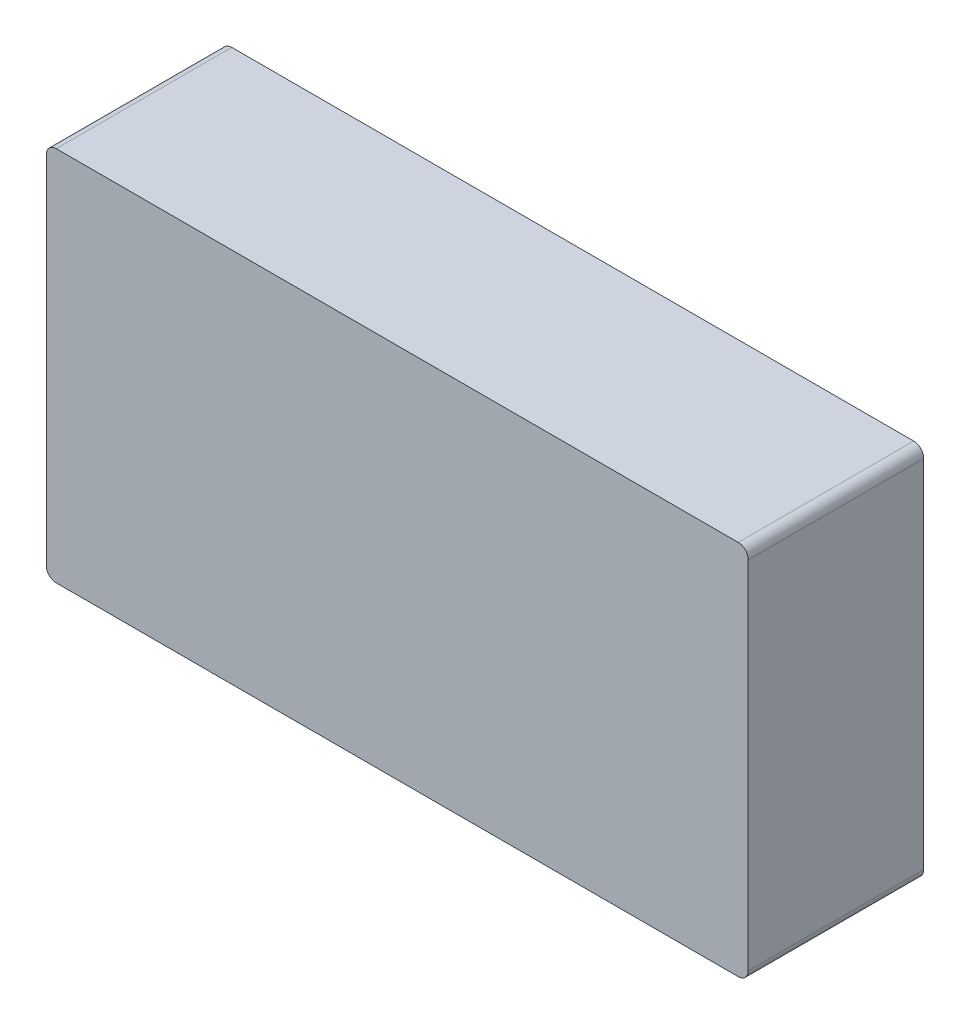
ISO-10303-21;
HEADER;
FILE_DESCRIPTION(('STEP AP214'),'2;1');
FILE_NAME('part.step','',(''),(''),'','','');
FILE_SCHEMA(('AUTOMOTIVE_DESIGN { 1 0 10303 214 1 1 1 1 }'));
ENDSEC;
DATA;
#1=APPLICATION_CONTEXT('core data for automotive mechanical design processes');
#2=APPLICATION_PROTOCOL_DEFINITION('international standard','automotive_design',2000,#1);
#3=PRODUCT_CONTEXT('',#1,'mechanical');
#4=PRODUCT('Part','Part','',(#3));
#5=PRODUCT_RELATED_PRODUCT_CATEGORY('part','',(#4));
#6=PRODUCT_DEFINITION_FORMATION('','',#4);
#7=PRODUCT_DEFINITION_CONTEXT('part definition',#1,'design');
#8=PRODUCT_DEFINITION('design','',#6,#7);
#9=PRODUCT_DEFINITION_SHAPE('','',#8);
#10=(LENGTH_UNIT() NAMED_UNIT(*) SI_UNIT(.MILLI.,.METRE.));
#11=(NAMED_UNIT(*) PLANE_ANGLE_UNIT() SI_UNIT($,.RADIAN.));
#12=(NAMED_UNIT(*) SI_UNIT($,.STERADIAN.) SOLID_ANGLE_UNIT());
#13=UNCERTAINTY_MEASURE_WITH_UNIT(LENGTH_MEASURE(1.E-05),#10,'distance_accuracy_value','');
#14=(GEOMETRIC_REPRESENTATION_CONTEXT(3) GLOBAL_UNCERTAINTY_ASSIGNED_CONTEXT((#13)) GLOBAL_UNIT_ASSIGNED_CONTEXT((#10,
#11,#12)) REPRESENTATION_CONTEXT('',''));
#15=CARTESIAN_POINT('',(0.,0.,0.));
#16=DIRECTION('',(0.,0.,1.));
#17=DIRECTION('',(1.,0.,0.));
#18=AXIS2_PLACEMENT_3D('',#15,#16,#17);
#19=CARTESIAN_POINT('',(0.,0.,0.));
#20=DIRECTION('',(0.,0.,-1.));
#21=DIRECTION('',(-1.,0.,0.));
#22=AXIS2_PLACEMENT_3D('',#19,#20,#21);
#23=PLANE('',#22);
#24=DIRECTION('',(0.,1.,0.));
#25=VECTOR('',#24,1.);
#26=CARTESIAN_POINT('',(70.,-37.5,0.));
#27=LINE('',#26,#25);
#28=CARTESIAN_POINT('',(70.,-35.5,0.));
#29=VERTEX_POINT('',#28);
#30=CARTESIAN_POINT('',(70.,35.5,0.));
#31=VERTEX_POINT('',#30);
#32=EDGE_CURVE('E153',#29,#31,#27,.T.);
#33=ORIENTED_EDGE('',*,*,#32,.F.);
#34=CARTESIAN_POINT('',(68.,-35.5,0.));
#35=DIRECTION('',(0.,0.,-1.));
#36=DIRECTION('',(-1.,0.,0.));
#37=AXIS2_PLACEMENT_3D('',#34,#35,#36);
#38=CIRCLE('',#37,2.);
#39=CARTESIAN_POINT('',(68.,-37.5,0.));
#40=VERTEX_POINT('',#39);
#41=EDGE_CURVE('E201',#29,#40,#38,.T.);
#42=ORIENTED_EDGE('',*,*,#41,.T.);
#43=DIRECTION('',(1.,0.,0.));
#44=VECTOR('',#43,1.);
#45=CARTESIAN_POINT('',(-70.,-37.5,0.));
#46=LINE('',#45,#44);
#47=CARTESIAN_POINT('',(-68.,-37.5,0.));
#48=VERTEX_POINT('',#47);
#49=EDGE_CURVE('E179',#48,#40,#46,.T.);
#50=ORIENTED_EDGE('',*,*,#49,.F.);
#51=CARTESIAN_POINT('',(-68.,-35.5,0.));
#52=DIRECTION('',(0.,0.,-1.));
#53=DIRECTION('',(-1.,0.,0.));
#54=AXIS2_PLACEMENT_3D('',#51,#52,#53);
#55=CIRCLE('',#54,2.);
#56=CARTESIAN_POINT('',(-70.,-35.5,0.));
#57=VERTEX_POINT('',#56);
#58=EDGE_CURVE('E203',#48,#57,#55,.T.);
#59=ORIENTED_EDGE('',*,*,#58,.T.);
#60=DIRECTION('',(0.,-1.,0.));
#61=VECTOR('',#60,1.);
#62=CARTESIAN_POINT('',(-70.,-37.5,0.));
#63=LINE('',#62,#61);
#64=CARTESIAN_POINT('',(-70.,35.5,0.));
#65=VERTEX_POINT('',#64);
#66=EDGE_CURVE('E190',#65,#57,#63,.T.);
#67=ORIENTED_EDGE('',*,*,#66,.F.);
#68=CARTESIAN_POINT('',(-68.,35.5,0.));
#69=DIRECTION('',(0.,0.,-1.));
#70=DIRECTION('',(-1.,0.,0.));
#71=AXIS2_PLACEMENT_3D('',#68,#69,#70);
#72=CIRCLE('',#71,2.);
#73=CARTESIAN_POINT('',(-68.,37.5,0.));
#74=VERTEX_POINT('',#73);
#75=EDGE_CURVE('E200',#65,#74,#72,.T.);
#76=ORIENTED_EDGE('',*,*,#75,.T.);
#77=DIRECTION('',(-1.,0.,0.));
#78=VECTOR('',#77,1.);
#79=CARTESIAN_POINT('',(-70.,37.5,0.));
#80=LINE('',#79,#78);
#81=CARTESIAN_POINT('',(68.,37.5,0.));
#82=VERTEX_POINT('',#81);
#83=EDGE_CURVE('E160',#82,#74,#80,.T.);
#84=ORIENTED_EDGE('',*,*,#83,.F.);
#85=CARTESIAN_POINT('',(68.,35.5,0.));
#86=DIRECTION('',(0.,0.,-1.));
#87=DIRECTION('',(-1.,0.,0.));
#88=AXIS2_PLACEMENT_3D('',#85,#86,#87);
#89=CIRCLE('',#88,2.);
#90=EDGE_CURVE('E197',#82,#31,#89,.T.);
#91=ORIENTED_EDGE('',*,*,#90,.T.);
#92=EDGE_LOOP('',(#33,#42,#50,#59,#67,#76,#84,#91));
#93=FACE_BOUND('',#92,.T.);
#94=DIRECTION('',(1.,0.,0.));
#95=VECTOR('',#94,1.);
#96=CARTESIAN_POINT('',(0.,-35.,0.));
#97=LINE('',#96,#95);
#98=CARTESIAN_POINT('',(-67.5,-35.,0.));
#99=VERTEX_POINT('',#98);
#100=CARTESIAN_POINT('',(67.5,-35.,0.));
#101=VERTEX_POINT('',#100);
#102=EDGE_CURVE('E146',#99,#101,#97,.T.);
#103=ORIENTED_EDGE('',*,*,#102,.T.);
#104=DIRECTION('',(0.,1.,0.));
#105=VECTOR('',#104,1.);
#106=CARTESIAN_POINT('',(67.5,0.,0.));
#107=LINE('',#106,#105);
#108=CARTESIAN_POINT('',(67.5,35.,0.));
#109=VERTEX_POINT('',#108);
#110=EDGE_CURVE('E170',#101,#109,#107,.T.);
#111=ORIENTED_EDGE('',*,*,#110,.T.);
#112=DIRECTION('',(-1.,0.,0.));
#113=VECTOR('',#112,1.);
#114=CARTESIAN_POINT('',(0.,35.,0.));
#115=LINE('',#114,#113);
#116=CARTESIAN_POINT('',(-67.5,35.,0.));
#117=VERTEX_POINT('',#116);
#118=EDGE_CURVE('E155',#109,#117,#115,.T.);
#119=ORIENTED_EDGE('',*,*,#118,.T.);
#120=DIRECTION('',(0.,-1.,0.));
#121=VECTOR('',#120,1.);
#122=CARTESIAN_POINT('',(-67.5,0.,0.));
#123=LINE('',#122,#121);
#124=EDGE_CURVE('E173',#117,#99,#123,.T.);
#125=ORIENTED_EDGE('',*,*,#124,.T.);
#126=EDGE_LOOP('',(#103,#111,#119,#125));
#127=FACE_BOUND('',#126,.T.);
#128=ADVANCED_FACE('F39',(#93,#127),#23,.T.);
#129=CARTESIAN_POINT('',(70.,-37.5,35.));
#130=DIRECTION('',(-1.,0.,0.));
#131=DIRECTION('',(0.,0.,1.));
#132=AXIS2_PLACEMENT_3D('',#129,#130,#131);
#133=PLANE('',#132);
#134=DIRECTION('',(0.,1.,0.));
#135=VECTOR('',#134,1.);
#136=CARTESIAN_POINT('',(70.,-37.5,35.));
#137=LINE('',#136,#135);
#138=CARTESIAN_POINT('',(70.,-35.5,35.));
#139=VERTEX_POINT('',#138);
#140=CARTESIAN_POINT('',(70.,35.5,35.));
#141=VERTEX_POINT('',#140);
#142=EDGE_CURVE('E171',#139,#141,#137,.T.);
#143=ORIENTED_EDGE('',*,*,#142,.F.);
#144=DIRECTION('',(0.,0.,-1.));
#145=VECTOR('',#144,1.);
#146=CARTESIAN_POINT('',(70.,-35.5,35.));
#147=LINE('',#146,#145);
#148=EDGE_CURVE('E194',#139,#29,#147,.T.);
#149=ORIENTED_EDGE('',*,*,#148,.T.);
#150=ORIENTED_EDGE('',*,*,#32,.T.);
#151=DIRECTION('',(0.,0.,-1.));
#152=VECTOR('',#151,1.);
#153=CARTESIAN_POINT('',(70.,35.5,35.));
#154=LINE('',#153,#152);
#155=EDGE_CURVE('E183',#31,#141,#154,.F.);
#156=ORIENTED_EDGE('',*,*,#155,.T.);
#157=EDGE_LOOP('',(#143,#149,#150,#156));
#158=FACE_BOUND('',#157,.T.);
#159=ADVANCED_FACE('F251',(#158),#133,.F.);
#160=CARTESIAN_POINT('',(-70.,37.5,35.));
#161=DIRECTION('',(0.,-1.,0.));
#162=DIRECTION('',(0.,0.,-1.));
#163=AXIS2_PLACEMENT_3D('',#160,#161,#162);
#164=PLANE('',#163);
#165=ORIENTED_EDGE('',*,*,#83,.T.);
#166=DIRECTION('',(0.,0.,-1.));
#167=VECTOR('',#166,1.);
#168=CARTESIAN_POINT('',(-68.,37.5,35.));
#169=LINE('',#168,#167);
#170=CARTESIAN_POINT('',(-68.,37.5,35.));
#171=VERTEX_POINT('',#170);
#172=EDGE_CURVE('E11',#74,#171,#169,.F.);
#173=ORIENTED_EDGE('',*,*,#172,.T.);
#174=DIRECTION('',(-1.,0.,0.));
#175=VECTOR('',#174,1.);
#176=CARTESIAN_POINT('',(-70.,37.5,35.));
#177=LINE('',#176,#175);
#178=CARTESIAN_POINT('',(68.,37.5,35.));
#179=VERTEX_POINT('',#178);
#180=EDGE_CURVE('E178',#179,#171,#177,.T.);
#181=ORIENTED_EDGE('',*,*,#180,.F.);
#182=DIRECTION('',(0.,0.,-1.));
#183=VECTOR('',#182,1.);
#184=CARTESIAN_POINT('',(68.,37.5,35.));
#185=LINE('',#184,#183);
#186=EDGE_CURVE('E50',#179,#82,#185,.T.);
#187=ORIENTED_EDGE('',*,*,#186,.T.);
#188=EDGE_LOOP('',(#165,#173,#181,#187));
#189=FACE_BOUND('',#188,.T.);
#190=ADVANCED_FACE('F223',(#189),#164,.F.);
#191=CARTESIAN_POINT('',(-70.,-37.5,35.));
#192=DIRECTION('',(1.,0.,0.));
#193=DIRECTION('',(0.,0.,-1.));
#194=AXIS2_PLACEMENT_3D('',#191,#192,#193);
#195=PLANE('',#194);
#196=ORIENTED_EDGE('',*,*,#66,.T.);
#197=DIRECTION('',(0.,0.,-1.));
#198=VECTOR('',#197,1.);
#199=CARTESIAN_POINT('',(-70.,-35.5,35.));
#200=LINE('',#199,#198);
#201=CARTESIAN_POINT('',(-70.,-35.5,35.));
#202=VERTEX_POINT('',#201);
#203=EDGE_CURVE('E53',#57,#202,#200,.F.);
#204=ORIENTED_EDGE('',*,*,#203,.T.);
#205=DIRECTION('',(0.,-1.,0.));
#206=VECTOR('',#205,1.);
#207=CARTESIAN_POINT('',(-70.,-37.5,35.));
#208=LINE('',#207,#206);
#209=CARTESIAN_POINT('',(-70.,35.5,35.));
#210=VERTEX_POINT('',#209);
#211=EDGE_CURVE('E182',#210,#202,#208,.T.);
#212=ORIENTED_EDGE('',*,*,#211,.F.);
#213=DIRECTION('',(0.,0.,-1.));
#214=VECTOR('',#213,1.);
#215=CARTESIAN_POINT('',(-70.,35.5,35.));
#216=LINE('',#215,#214);
#217=EDGE_CURVE('E220',#210,#65,#216,.T.);
#218=ORIENTED_EDGE('',*,*,#217,.T.);
#219=EDGE_LOOP('',(#196,#204,#212,#218));
#220=FACE_BOUND('',#219,.T.);
#221=ADVANCED_FACE('F237',(#220),#195,.F.);
#222=CARTESIAN_POINT('',(-70.,-37.5,35.));
#223=DIRECTION('',(0.,1.,0.));
#224=DIRECTION('',(0.,0.,1.));
#225=AXIS2_PLACEMENT_3D('',#222,#223,#224);
#226=PLANE('',#225);
#227=ORIENTED_EDGE('',*,*,#49,.T.);
#228=DIRECTION('',(0.,0.,-1.));
#229=VECTOR('',#228,1.);
#230=CARTESIAN_POINT('',(68.,-37.5,35.));
#231=LINE('',#230,#229);
#232=CARTESIAN_POINT('',(68.,-37.5,35.));
#233=VERTEX_POINT('',#232);
#234=EDGE_CURVE('E208',#40,#233,#231,.F.);
#235=ORIENTED_EDGE('',*,*,#234,.T.);
#236=DIRECTION('',(1.,0.,0.));
#237=VECTOR('',#236,1.);
#238=CARTESIAN_POINT('',(-70.,-37.5,35.));
#239=LINE('',#238,#237);
#240=CARTESIAN_POINT('',(-68.,-37.5,35.));
#241=VERTEX_POINT('',#240);
#242=EDGE_CURVE('E181',#241,#233,#239,.T.);
#243=ORIENTED_EDGE('',*,*,#242,.F.);
#244=DIRECTION('',(0.,0.,-1.));
#245=VECTOR('',#244,1.);
#246=CARTESIAN_POINT('',(-68.,-37.5,35.));
#247=LINE('',#246,#245);
#248=EDGE_CURVE('E202',#241,#48,#247,.T.);
#249=ORIENTED_EDGE('',*,*,#248,.T.);
#250=EDGE_LOOP('',(#227,#235,#243,#249));
#251=FACE_BOUND('',#250,.T.);
#252=ADVANCED_FACE('F241',(#251),#226,.F.);
#253=CARTESIAN_POINT('',(0.,0.,35.));
#254=DIRECTION('',(0.,0.,-1.));
#255=DIRECTION('',(-1.,0.,0.));
#256=AXIS2_PLACEMENT_3D('',#253,#254,#255);
#257=PLANE('',#256);
#258=ORIENTED_EDGE('',*,*,#242,.T.);
#259=CARTESIAN_POINT('',(68.,-35.5,35.));
#260=DIRECTION('',(0.,0.,-1.));
#261=DIRECTION('',(-1.,0.,0.));
#262=AXIS2_PLACEMENT_3D('',#259,#260,#261);
#263=CIRCLE('',#262,2.);
#264=EDGE_CURVE('E214',#233,#139,#263,.F.);
#265=ORIENTED_EDGE('',*,*,#264,.T.);
#266=ORIENTED_EDGE('',*,*,#142,.T.);
#267=CARTESIAN_POINT('',(68.,35.5,35.));
#268=DIRECTION('',(0.,0.,-1.));
#269=DIRECTION('',(-1.,0.,0.));
#270=AXIS2_PLACEMENT_3D('',#267,#268,#269);
#271=CIRCLE('',#270,2.);
#272=EDGE_CURVE('E209',#141,#179,#271,.F.);
#273=ORIENTED_EDGE('',*,*,#272,.T.);
#274=ORIENTED_EDGE('',*,*,#180,.T.);
#275=CARTESIAN_POINT('',(-68.,35.5,35.));
#276=DIRECTION('',(0.,0.,-1.));
#277=DIRECTION('',(-1.,0.,0.));
#278=AXIS2_PLACEMENT_3D('',#275,#276,#277);
#279=CIRCLE('',#278,2.);
#280=EDGE_CURVE('E63',#171,#210,#279,.F.);
#281=ORIENTED_EDGE('',*,*,#280,.T.);
#282=ORIENTED_EDGE('',*,*,#211,.T.);
#283=CARTESIAN_POINT('',(-68.,-35.5,35.));
#284=DIRECTION('',(0.,0.,-1.));
#285=DIRECTION('',(-1.,0.,0.));
#286=AXIS2_PLACEMENT_3D('',#283,#284,#285);
#287=CIRCLE('',#286,2.);
#288=EDGE_CURVE('E213',#202,#241,#287,.F.);
#289=ORIENTED_EDGE('',*,*,#288,.T.);
#290=EDGE_LOOP('',(#258,#265,#266,#273,#274,#281,#282,#289));
#291=FACE_BOUND('',#290,.T.);
#292=ADVANCED_FACE('F236',(#291),#257,.F.);
#293=CARTESIAN_POINT('',(67.5,-37.5,35.));
#294=DIRECTION('',(-1.,0.,0.));
#295=DIRECTION('',(0.,0.,1.));
#296=AXIS2_PLACEMENT_3D('',#293,#294,#295);
#297=PLANE('',#296);
#298=ORIENTED_EDGE('',*,*,#110,.F.);
#299=DIRECTION('',(0.,0.,-1.));
#300=VECTOR('',#299,1.);
#301=CARTESIAN_POINT('',(67.5,-35.,35.));
#302=LINE('',#301,#300);
#303=CARTESIAN_POINT('',(67.5,-35.,32.5));
#304=VERTEX_POINT('',#303);
#305=EDGE_CURVE('E150',#304,#101,#302,.T.);
#306=ORIENTED_EDGE('',*,*,#305,.F.);
#307=DIRECTION('',(0.,1.,0.));
#308=VECTOR('',#307,1.);
#309=CARTESIAN_POINT('',(67.5,0.,32.5));
#310=LINE('',#309,#308);
#311=CARTESIAN_POINT('',(67.5,35.,32.5));
#312=VERTEX_POINT('',#311);
#313=EDGE_CURVE('E132',#304,#312,#310,.T.);
#314=ORIENTED_EDGE('',*,*,#313,.T.);
#315=DIRECTION('',(0.,0.,-1.));
#316=VECTOR('',#315,1.);
#317=CARTESIAN_POINT('',(67.5,35.,35.));
#318=LINE('',#317,#316);
#319=EDGE_CURVE('E144',#312,#109,#318,.T.);
#320=ORIENTED_EDGE('',*,*,#319,.T.);
#321=EDGE_LOOP('',(#298,#306,#314,#320));
#322=FACE_BOUND('',#321,.T.);
#323=ADVANCED_FACE('F145',(#322),#297,.T.);
#324=CARTESIAN_POINT('',(-70.,35.,35.));
#325=DIRECTION('',(0.,-1.,0.));
#326=DIRECTION('',(0.,0.,-1.));
#327=AXIS2_PLACEMENT_3D('',#324,#325,#326);
#328=PLANE('',#327);
#329=ORIENTED_EDGE('',*,*,#118,.F.);
#330=ORIENTED_EDGE('',*,*,#319,.F.);
#331=DIRECTION('',(-1.,0.,0.));
#332=VECTOR('',#331,1.);
#333=CARTESIAN_POINT('',(0.,35.,32.5));
#334=LINE('',#333,#332);
#335=CARTESIAN_POINT('',(-67.5,35.,32.5));
#336=VERTEX_POINT('',#335);
#337=EDGE_CURVE('E129',#312,#336,#334,.T.);
#338=ORIENTED_EDGE('',*,*,#337,.T.);
#339=DIRECTION('',(0.,0.,-1.));
#340=VECTOR('',#339,1.);
#341=CARTESIAN_POINT('',(-67.5,35.,35.));
#342=LINE('',#341,#340);
#343=EDGE_CURVE('E152',#336,#117,#342,.T.);
#344=ORIENTED_EDGE('',*,*,#343,.T.);
#345=EDGE_LOOP('',(#329,#330,#338,#344));
#346=FACE_BOUND('',#345,.T.);
#347=ADVANCED_FACE('F147',(#346),#328,.T.);
#348=CARTESIAN_POINT('',(-67.5,-37.5,35.));
#349=DIRECTION('',(1.,0.,0.));
#350=DIRECTION('',(0.,0.,-1.));
#351=AXIS2_PLACEMENT_3D('',#348,#349,#350);
#352=PLANE('',#351);
#353=ORIENTED_EDGE('',*,*,#124,.F.);
#354=ORIENTED_EDGE('',*,*,#343,.F.);
#355=DIRECTION('',(0.,-1.,0.));
#356=VECTOR('',#355,1.);
#357=CARTESIAN_POINT('',(-67.5,0.,32.5));
#358=LINE('',#357,#356);
#359=CARTESIAN_POINT('',(-67.5,-35.,32.5));
#360=VERTEX_POINT('',#359);
#361=EDGE_CURVE('E135',#336,#360,#358,.T.);
#362=ORIENTED_EDGE('',*,*,#361,.T.);
#363=DIRECTION('',(0.,0.,-1.));
#364=VECTOR('',#363,1.);
#365=CARTESIAN_POINT('',(-67.5,-35.,35.));
#366=LINE('',#365,#364);
#367=EDGE_CURVE('E157',#360,#99,#366,.T.);
#368=ORIENTED_EDGE('',*,*,#367,.T.);
#369=EDGE_LOOP('',(#353,#354,#362,#368));
#370=FACE_BOUND('',#369,.T.);
#371=ADVANCED_FACE('F315',(#370),#352,.T.);
#372=CARTESIAN_POINT('',(-70.,-35.,35.));
#373=DIRECTION('',(0.,1.,0.));
#374=DIRECTION('',(0.,0.,1.));
#375=AXIS2_PLACEMENT_3D('',#372,#373,#374);
#376=PLANE('',#375);
#377=ORIENTED_EDGE('',*,*,#102,.F.);
#378=ORIENTED_EDGE('',*,*,#367,.F.);
#379=DIRECTION('',(1.,0.,0.));
#380=VECTOR('',#379,1.);
#381=CARTESIAN_POINT('',(0.,-35.,32.5));
#382=LINE('',#381,#380);
#383=EDGE_CURVE('E165',#360,#304,#382,.T.);
#384=ORIENTED_EDGE('',*,*,#383,.T.);
#385=ORIENTED_EDGE('',*,*,#305,.T.);
#386=EDGE_LOOP('',(#377,#378,#384,#385));
#387=FACE_BOUND('',#386,.T.);
#388=ADVANCED_FACE('F301',(#387),#376,.T.);
#389=CARTESIAN_POINT('',(0.,0.,32.5));
#390=DIRECTION('',(0.,0.,-1.));
#391=DIRECTION('',(-1.,0.,0.));
#392=AXIS2_PLACEMENT_3D('',#389,#390,#391);
#393=PLANE('',#392);
#394=ORIENTED_EDGE('',*,*,#313,.F.);
#395=ORIENTED_EDGE('',*,*,#383,.F.);
#396=ORIENTED_EDGE('',*,*,#361,.F.);
#397=ORIENTED_EDGE('',*,*,#337,.F.);
#398=EDGE_LOOP('',(#394,#395,#396,#397));
#399=FACE_BOUND('',#398,.T.);
#400=ADVANCED_FACE('F133',(#399),#393,.T.);
#401=CARTESIAN_POINT('',(68.,-35.5,35.));
#402=DIRECTION('',(0.,0.,-1.));
#403=DIRECTION('',(-1.,0.,0.));
#404=AXIS2_PLACEMENT_3D('',#401,#402,#403);
#405=CYLINDRICAL_SURFACE('',#404,2.);
#406=ORIENTED_EDGE('',*,*,#264,.F.);
#407=ORIENTED_EDGE('',*,*,#234,.F.);
#408=ORIENTED_EDGE('',*,*,#41,.F.);
#409=ORIENTED_EDGE('',*,*,#148,.F.);
#410=EDGE_LOOP('',(#406,#407,#408,#409));
#411=FACE_BOUND('',#410,.T.);
#412=ADVANCED_FACE('F246',(#411),#405,.T.);
#413=CARTESIAN_POINT('',(-68.,-35.5,35.));
#414=DIRECTION('',(0.,0.,-1.));
#415=DIRECTION('',(-1.,0.,0.));
#416=AXIS2_PLACEMENT_3D('',#413,#414,#415);
#417=CYLINDRICAL_SURFACE('',#416,2.);
#418=ORIENTED_EDGE('',*,*,#288,.F.);
#419=ORIENTED_EDGE('',*,*,#203,.F.);
#420=ORIENTED_EDGE('',*,*,#58,.F.);
#421=ORIENTED_EDGE('',*,*,#248,.F.);
#422=EDGE_LOOP('',(#418,#419,#420,#421));
#423=FACE_BOUND('',#422,.T.);
#424=ADVANCED_FACE('F244',(#423),#417,.T.);
#425=CARTESIAN_POINT('',(-68.,35.5,35.));
#426=DIRECTION('',(0.,0.,-1.));
#427=DIRECTION('',(-1.,0.,0.));
#428=AXIS2_PLACEMENT_3D('',#425,#426,#427);
#429=CYLINDRICAL_SURFACE('',#428,2.);
#430=ORIENTED_EDGE('',*,*,#280,.F.);
#431=ORIENTED_EDGE('',*,*,#172,.F.);
#432=ORIENTED_EDGE('',*,*,#75,.F.);
#433=ORIENTED_EDGE('',*,*,#217,.F.);
#434=EDGE_LOOP('',(#430,#431,#432,#433));
#435=FACE_BOUND('',#434,.T.);
#436=ADVANCED_FACE('F231',(#435),#429,.T.);
#437=CARTESIAN_POINT('',(68.,35.5,35.));
#438=DIRECTION('',(0.,0.,-1.));
#439=DIRECTION('',(-1.,0.,0.));
#440=AXIS2_PLACEMENT_3D('',#437,#438,#439);
#441=CYLINDRICAL_SURFACE('',#440,2.);
#442=ORIENTED_EDGE('',*,*,#272,.F.);
#443=ORIENTED_EDGE('',*,*,#155,.F.);
#444=ORIENTED_EDGE('',*,*,#90,.F.);
#445=ORIENTED_EDGE('',*,*,#186,.F.);
#446=EDGE_LOOP('',(#442,#443,#444,#445));
#447=FACE_BOUND('',#446,.T.);
#448=ADVANCED_FACE('F41',(#447),#441,.T.);
#449=CLOSED_SHELL('',(#128,#159,#190,#221,#252,#292,#323,#347,#371,#388,#400,#412,#424,#436,#448));
#450=MANIFOLD_SOLID_BREP('B2',#449);
#451=ADVANCED_BREP_SHAPE_REPRESENTATION('',(#18,#450),#14);
#452=SHAPE_DEFINITION_REPRESENTATION(#9,#451);
ENDSEC;
END-ISO-10303-21;
